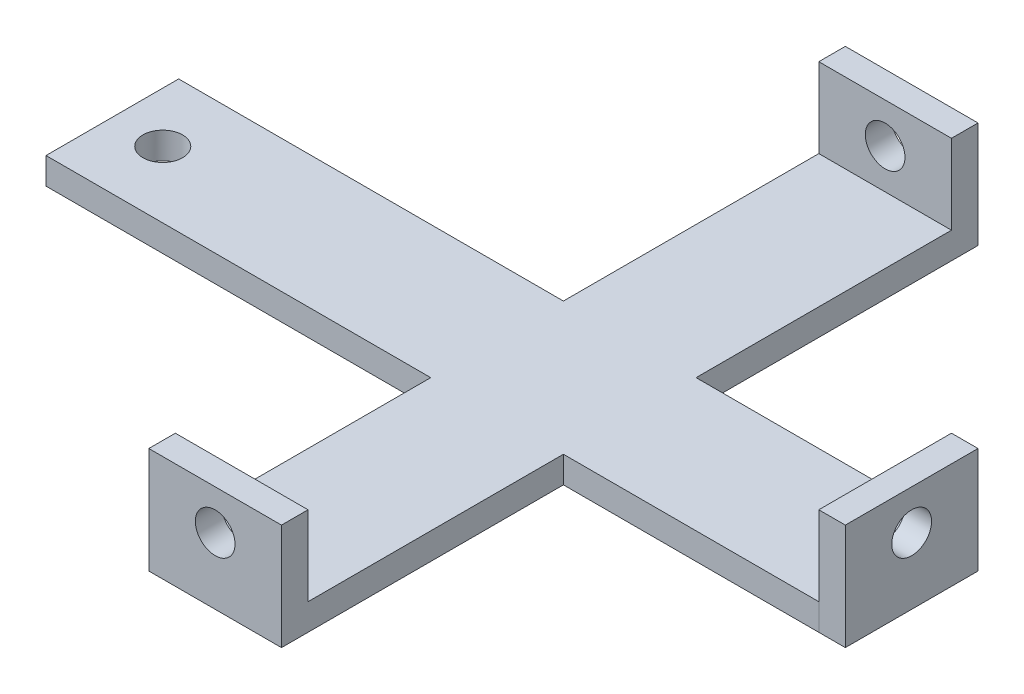
ISO-10303-21;
HEADER;
FILE_DESCRIPTION(('STEP AP214'),'2;1');
FILE_NAME('part.step','',(''),(''),'','','');
FILE_SCHEMA(('AUTOMOTIVE_DESIGN { 1 0 10303 214 1 1 1 1 }'));
ENDSEC;
DATA;
#1=APPLICATION_CONTEXT('core data for automotive mechanical design processes');
#2=APPLICATION_PROTOCOL_DEFINITION('international standard','automotive_design',2000,#1);
#3=PRODUCT_CONTEXT('',#1,'mechanical');
#4=PRODUCT('Part','Part','',(#3));
#5=PRODUCT_RELATED_PRODUCT_CATEGORY('part','',(#4));
#6=PRODUCT_DEFINITION_FORMATION('','',#4);
#7=PRODUCT_DEFINITION_CONTEXT('part definition',#1,'design');
#8=PRODUCT_DEFINITION('design','',#6,#7);
#9=PRODUCT_DEFINITION_SHAPE('','',#8);
#10=(LENGTH_UNIT() NAMED_UNIT(*) SI_UNIT(.MILLI.,.METRE.));
#11=(NAMED_UNIT(*) PLANE_ANGLE_UNIT() SI_UNIT($,.RADIAN.));
#12=(NAMED_UNIT(*) SI_UNIT($,.STERADIAN.) SOLID_ANGLE_UNIT());
#13=UNCERTAINTY_MEASURE_WITH_UNIT(LENGTH_MEASURE(1.E-05),#10,'distance_accuracy_value','');
#14=(GEOMETRIC_REPRESENTATION_CONTEXT(3) GLOBAL_UNCERTAINTY_ASSIGNED_CONTEXT((#13)) GLOBAL_UNIT_ASSIGNED_CONTEXT((#10,
#11,#12)) REPRESENTATION_CONTEXT('',''));
#15=CARTESIAN_POINT('',(0.,0.,0.));
#16=DIRECTION('',(0.,0.,1.));
#17=DIRECTION('',(1.,0.,0.));
#18=AXIS2_PLACEMENT_3D('',#15,#16,#17);
#19=CARTESIAN_POINT('',(39.6875,5.588,-23.1775));
#20=DIRECTION('',(0.,0.,1.));
#21=DIRECTION('',(1.,0.,0.));
#22=AXIS2_PLACEMENT_3D('',#19,#20,#21);
#23=PLANE('',#22);
#24=DIRECTION('',(0.,1.,0.));
#25=VECTOR('',#24,1.);
#26=CARTESIAN_POINT('',(37.1475,5.588,-23.1775));
#27=LINE('',#26,#25);
#28=CARTESIAN_POINT('',(37.1475,5.588,-23.1775));
#29=VERTEX_POINT('',#28);
#30=CARTESIAN_POINT('',(37.1475,15.748,-23.1775));
#31=VERTEX_POINT('',#30);
#32=EDGE_CURVE('E109',#29,#31,#27,.T.);
#33=ORIENTED_EDGE('',*,*,#32,.F.);
#34=DIRECTION('',(-1.,0.,0.));
#35=VECTOR('',#34,1.);
#36=CARTESIAN_POINT('',(39.6875,5.588,-23.1775));
#37=LINE('',#36,#35);
#38=CARTESIAN_POINT('',(39.6875,5.588,-23.1775));
#39=VERTEX_POINT('',#38);
#40=EDGE_CURVE('E12',#39,#29,#37,.T.);
#41=ORIENTED_EDGE('',*,*,#40,.F.);
#42=DIRECTION('',(0.,1.,0.));
#43=VECTOR('',#42,1.);
#44=CARTESIAN_POINT('',(39.6875,5.588,-23.1775));
#45=LINE('',#44,#43);
#46=CARTESIAN_POINT('',(39.6875,15.748,-23.1775));
#47=VERTEX_POINT('',#46);
#48=EDGE_CURVE('E103',#39,#47,#45,.T.);
#49=ORIENTED_EDGE('',*,*,#48,.T.);
#50=DIRECTION('',(-1.,0.,0.));
#51=VECTOR('',#50,1.);
#52=CARTESIAN_POINT('',(39.6875,15.748,-23.1775));
#53=LINE('',#52,#51);
#54=EDGE_CURVE('E46',#47,#31,#53,.T.);
#55=ORIENTED_EDGE('',*,*,#54,.T.);
#56=EDGE_LOOP('',(#33,#41,#49,#55));
#57=FACE_BOUND('',#56,.T.);
#58=ADVANCED_FACE('F43',(#57),#23,.T.);
#59=CARTESIAN_POINT('',(39.6875,5.588,-23.1775));
#60=DIRECTION('',(0.,1.,0.));
#61=DIRECTION('',(0.,0.,1.));
#62=AXIS2_PLACEMENT_3D('',#59,#60,#61);
#63=PLANE('',#62);
#64=DIRECTION('',(0.,0.,-1.));
#65=VECTOR('',#64,1.);
#66=CARTESIAN_POINT('',(37.1475,5.588,-23.1775));
#67=LINE('',#66,#65);
#68=CARTESIAN_POINT('',(37.1475,5.588,-35.8775));
#69=VERTEX_POINT('',#68);
#70=EDGE_CURVE('E76',#29,#69,#67,.T.);
#71=ORIENTED_EDGE('',*,*,#70,.T.);
#72=DIRECTION('',(-1.,0.,0.));
#73=VECTOR('',#72,1.);
#74=CARTESIAN_POINT('',(39.6875,5.588,-35.8775));
#75=LINE('',#74,#73);
#76=CARTESIAN_POINT('',(39.6875,5.588,-35.8775));
#77=VERTEX_POINT('',#76);
#78=EDGE_CURVE('E52',#77,#69,#75,.T.);
#79=ORIENTED_EDGE('',*,*,#78,.F.);
#80=DIRECTION('',(0.,0.,-1.));
#81=VECTOR('',#80,1.);
#82=CARTESIAN_POINT('',(39.6875,5.588,-23.1775));
#83=LINE('',#82,#81);
#84=EDGE_CURVE('E93',#39,#77,#83,.T.);
#85=ORIENTED_EDGE('',*,*,#84,.F.);
#86=ORIENTED_EDGE('',*,*,#40,.T.);
#87=EDGE_LOOP('',(#71,#79,#85,#86));
#88=FACE_BOUND('',#87,.T.);
#89=ADVANCED_FACE('F120',(#88),#63,.F.);
#90=CARTESIAN_POINT('',(39.6875,5.588,-35.8775));
#91=DIRECTION('',(0.,0.,1.));
#92=DIRECTION('',(1.,0.,0.));
#93=AXIS2_PLACEMENT_3D('',#90,#91,#92);
#94=PLANE('',#93);
#95=DIRECTION('',(0.,1.,0.));
#96=VECTOR('',#95,1.);
#97=CARTESIAN_POINT('',(37.1475,5.588,-35.8775));
#98=LINE('',#97,#96);
#99=CARTESIAN_POINT('',(37.1475,15.748,-35.8775));
#100=VERTEX_POINT('',#99);
#101=EDGE_CURVE('E100',#69,#100,#98,.T.);
#102=ORIENTED_EDGE('',*,*,#101,.T.);
#103=DIRECTION('',(-1.,0.,0.));
#104=VECTOR('',#103,1.);
#105=CARTESIAN_POINT('',(39.6875,15.748,-35.8775));
#106=LINE('',#105,#104);
#107=CARTESIAN_POINT('',(39.6875,15.748,-35.8775));
#108=VERTEX_POINT('',#107);
#109=EDGE_CURVE('E97',#108,#100,#106,.T.);
#110=ORIENTED_EDGE('',*,*,#109,.F.);
#111=DIRECTION('',(0.,1.,0.));
#112=VECTOR('',#111,1.);
#113=CARTESIAN_POINT('',(39.6875,5.588,-35.8775));
#114=LINE('',#113,#112);
#115=EDGE_CURVE('E88',#77,#108,#114,.T.);
#116=ORIENTED_EDGE('',*,*,#115,.F.);
#117=ORIENTED_EDGE('',*,*,#78,.T.);
#118=EDGE_LOOP('',(#102,#110,#116,#117));
#119=FACE_BOUND('',#118,.T.);
#120=ADVANCED_FACE('F98',(#119),#94,.F.);
#121=CARTESIAN_POINT('',(39.6875,15.748,-23.1775));
#122=DIRECTION('',(0.,1.,0.));
#123=DIRECTION('',(0.,0.,1.));
#124=AXIS2_PLACEMENT_3D('',#121,#122,#123);
#125=PLANE('',#124);
#126=DIRECTION('',(0.,0.,-1.));
#127=VECTOR('',#126,1.);
#128=CARTESIAN_POINT('',(37.1475,15.748,-23.1775));
#129=LINE('',#128,#127);
#130=EDGE_CURVE('E112',#31,#100,#129,.T.);
#131=ORIENTED_EDGE('',*,*,#130,.F.);
#132=ORIENTED_EDGE('',*,*,#54,.F.);
#133=DIRECTION('',(0.,0.,-1.));
#134=VECTOR('',#133,1.);
#135=CARTESIAN_POINT('',(39.6875,15.748,-23.1775));
#136=LINE('',#135,#134);
#137=EDGE_CURVE('E92',#47,#108,#136,.T.);
#138=ORIENTED_EDGE('',*,*,#137,.T.);
#139=ORIENTED_EDGE('',*,*,#109,.T.);
#140=EDGE_LOOP('',(#131,#132,#138,#139));
#141=FACE_BOUND('',#140,.T.);
#142=ADVANCED_FACE('F102',(#141),#125,.T.);
#143=CARTESIAN_POINT('',(39.6875,0.,0.));
#144=DIRECTION('',(-1.,0.,0.));
#145=DIRECTION('',(0.,0.,1.));
#146=AXIS2_PLACEMENT_3D('',#143,#144,#145);
#147=PLANE('',#146);
#148=CARTESIAN_POINT('',(39.6875,11.938,-29.5275));
#149=DIRECTION('',(1.,0.,0.));
#150=DIRECTION('',(0.,0.,-1.));
#151=AXIS2_PLACEMENT_3D('',#148,#149,#150);
#152=CIRCLE('',#151,1.905);
#153=CARTESIAN_POINT('',(39.6875,11.938,-31.4325));
#154=VERTEX_POINT('',#153);
#155=EDGE_CURVE('E151',#154,#154,#152,.T.);
#156=ORIENTED_EDGE('',*,*,#155,.F.);
#157=EDGE_LOOP('',(#156));
#158=FACE_BOUND('',#157,.T.);
#159=ORIENTED_EDGE('',*,*,#48,.F.);
#160=ORIENTED_EDGE('',*,*,#84,.T.);
#161=ORIENTED_EDGE('',*,*,#115,.T.);
#162=ORIENTED_EDGE('',*,*,#137,.F.);
#163=EDGE_LOOP('',(#159,#160,#161,#162));
#164=FACE_BOUND('',#163,.T.);
#165=ADVANCED_FACE('F91',(#158,#164),#147,.F.);
#166=CARTESIAN_POINT('',(37.1475,0.,0.));
#167=DIRECTION('',(-1.,0.,0.));
#168=DIRECTION('',(0.,0.,1.));
#169=AXIS2_PLACEMENT_3D('',#166,#167,#168);
#170=PLANE('',#169);
#171=CARTESIAN_POINT('',(37.1475,11.938,-29.5275));
#172=DIRECTION('',(1.,0.,0.));
#173=DIRECTION('',(0.,0.,-1.));
#174=AXIS2_PLACEMENT_3D('',#171,#172,#173);
#175=CIRCLE('',#174,1.905);
#176=CARTESIAN_POINT('',(37.1475,11.938,-31.4325));
#177=VERTEX_POINT('',#176);
#178=EDGE_CURVE('E113',#177,#177,#175,.T.);
#179=ORIENTED_EDGE('',*,*,#178,.T.);
#180=EDGE_LOOP('',(#179));
#181=FACE_BOUND('',#180,.T.);
#182=ORIENTED_EDGE('',*,*,#32,.T.);
#183=ORIENTED_EDGE('',*,*,#130,.T.);
#184=ORIENTED_EDGE('',*,*,#101,.F.);
#185=ORIENTED_EDGE('',*,*,#70,.F.);
#186=EDGE_LOOP('',(#182,#183,#184,#185));
#187=FACE_BOUND('',#186,.T.);
#188=ADVANCED_FACE('F118',(#181,#187),#170,.T.);
#189=CARTESIAN_POINT('',(37.1475,11.938,-29.5275));
#190=DIRECTION('',(1.,0.,0.));
#191=DIRECTION('',(0.,0.,-1.));
#192=AXIS2_PLACEMENT_3D('',#189,#190,#191);
#193=CYLINDRICAL_SURFACE('',#192,1.905);
#194=ORIENTED_EDGE('',*,*,#178,.F.);
#195=EDGE_LOOP('',(#194));
#196=FACE_BOUND('',#195,.T.);
#197=ORIENTED_EDGE('',*,*,#155,.T.);
#198=EDGE_LOOP('',(#197));
#199=FACE_BOUND('',#198,.T.);
#200=ADVANCED_FACE('F139',(#196,#199),#193,.F.);
#201=CLOSED_SHELL('',(#58,#89,#120,#142,#165,#188,#200));
#202=MANIFOLD_SOLID_BREP('B2',#201);
#203=CARTESIAN_POINT('',(0.,0.,0.));
#204=DIRECTION('',(-1.,0.,0.));
#205=DIRECTION('',(0.,0.,1.));
#206=AXIS2_PLACEMENT_3D('',#203,#204,#205);
#207=PLANE('',#206);
#208=DIRECTION('',(0.,-1.,0.));
#209=VECTOR('',#208,1.);
#210=CARTESIAN_POINT('',(0.,8.128,-35.8775));
#211=LINE('',#210,#209);
#212=CARTESIAN_POINT('',(0.,8.128,-35.8775));
#213=VERTEX_POINT('',#212);
#214=CARTESIAN_POINT('',(0.,5.588,-35.8775));
#215=VERTEX_POINT('',#214);
#216=EDGE_CURVE('E324',#213,#215,#211,.T.);
#217=ORIENTED_EDGE('',*,*,#216,.F.);
#218=DIRECTION('',(0.,0.,1.));
#219=VECTOR('',#218,1.);
#220=CARTESIAN_POINT('',(0.,8.128,1.27));
#221=LINE('',#220,#219);
#222=CARTESIAN_POINT('',(0.,8.128,-60.325));
#223=VERTEX_POINT('',#222);
#224=EDGE_CURVE('E377',#223,#213,#221,.T.);
#225=ORIENTED_EDGE('',*,*,#224,.F.);
#226=DIRECTION('',(0.,-1.,0.));
#227=VECTOR('',#226,1.);
#228=CARTESIAN_POINT('',(0.,8.128,-60.325));
#229=LINE('',#228,#227);
#230=CARTESIAN_POINT('',(0.,15.748,-60.325));
#231=VERTEX_POINT('',#230);
#232=EDGE_CURVE('E387',#231,#223,#229,.T.);
#233=ORIENTED_EDGE('',*,*,#232,.F.);
#234=DIRECTION('',(0.,0.,-1.));
#235=VECTOR('',#234,1.);
#236=CARTESIAN_POINT('',(0.,15.748,-60.325));
#237=LINE('',#236,#235);
#238=CARTESIAN_POINT('',(0.,15.748,-62.865));
#239=VERTEX_POINT('',#238);
#240=EDGE_CURVE('E525',#231,#239,#237,.T.);
#241=ORIENTED_EDGE('',*,*,#240,.T.);
#242=DIRECTION('',(0.,1.,0.));
#243=VECTOR('',#242,1.);
#244=CARTESIAN_POINT('',(0.,8.128,-62.865));
#245=LINE('',#244,#243);
#246=CARTESIAN_POINT('',(0.,5.588,-62.865));
#247=VERTEX_POINT('',#246);
#248=EDGE_CURVE('E520',#239,#247,#245,.F.);
#249=ORIENTED_EDGE('',*,*,#248,.T.);
#250=DIRECTION('',(0.,0.,-1.));
#251=VECTOR('',#250,1.);
#252=CARTESIAN_POINT('',(0.,5.588,1.27));
#253=LINE('',#252,#251);
#254=EDGE_CURVE('E213',#247,#215,#253,.F.);
#255=ORIENTED_EDGE('',*,*,#254,.T.);
#256=EDGE_LOOP('',(#217,#225,#233,#241,#249,#255));
#257=FACE_BOUND('',#256,.T.);
#258=ADVANCED_FACE('F188',(#257),#207,.T.);
#259=CARTESIAN_POINT('',(12.7,0.,0.));
#260=DIRECTION('',(-1.,0.,0.));
#261=DIRECTION('',(0.,0.,1.));
#262=AXIS2_PLACEMENT_3D('',#259,#260,#261);
#263=PLANE('',#262);
#264=DIRECTION('',(0.,-1.,0.));
#265=VECTOR('',#264,1.);
#266=CARTESIAN_POINT('',(12.7,8.128,-23.1775));
#267=LINE('',#266,#265);
#268=CARTESIAN_POINT('',(12.7,8.128,-23.1775));
#269=VERTEX_POINT('',#268);
#270=CARTESIAN_POINT('',(12.7,5.588,-23.1775));
#271=VERTEX_POINT('',#270);
#272=EDGE_CURVE('E325',#269,#271,#267,.T.);
#273=ORIENTED_EDGE('',*,*,#272,.F.);
#274=DIRECTION('',(0.,0.,1.));
#275=VECTOR('',#274,1.);
#276=CARTESIAN_POINT('',(12.7,8.128,1.27));
#277=LINE('',#276,#275);
#278=CARTESIAN_POINT('',(12.7,8.128,1.27));
#279=VERTEX_POINT('',#278);
#280=EDGE_CURVE('E433',#269,#279,#277,.T.);
#281=ORIENTED_EDGE('',*,*,#280,.T.);
#282=DIRECTION('',(0.,1.,0.));
#283=VECTOR('',#282,1.);
#284=CARTESIAN_POINT('',(12.7,8.128,1.27));
#285=LINE('',#284,#283);
#286=CARTESIAN_POINT('',(12.7,15.748,1.27));
#287=VERTEX_POINT('',#286);
#288=EDGE_CURVE('E382',#279,#287,#285,.T.);
#289=ORIENTED_EDGE('',*,*,#288,.T.);
#290=DIRECTION('',(0.,0.,-1.));
#291=VECTOR('',#290,1.);
#292=CARTESIAN_POINT('',(12.7,15.748,3.81));
#293=LINE('',#292,#291);
#294=CARTESIAN_POINT('',(12.7,15.748,3.81));
#295=VERTEX_POINT('',#294);
#296=EDGE_CURVE('E385',#295,#287,#293,.T.);
#297=ORIENTED_EDGE('',*,*,#296,.F.);
#298=DIRECTION('',(0.,1.,0.));
#299=VECTOR('',#298,1.);
#300=CARTESIAN_POINT('',(12.7,8.128,3.81));
#301=LINE('',#300,#299);
#302=CARTESIAN_POINT('',(12.7,5.588,3.81));
#303=VERTEX_POINT('',#302);
#304=EDGE_CURVE('E423',#303,#295,#301,.T.);
#305=ORIENTED_EDGE('',*,*,#304,.F.);
#306=DIRECTION('',(0.,0.,-1.));
#307=VECTOR('',#306,1.);
#308=CARTESIAN_POINT('',(12.7,5.588,1.27));
#309=LINE('',#308,#307);
#310=EDGE_CURVE('E418',#271,#303,#309,.F.);
#311=ORIENTED_EDGE('',*,*,#310,.F.);
#312=EDGE_LOOP('',(#273,#281,#289,#297,#305,#311));
#313=FACE_BOUND('',#312,.T.);
#314=ADVANCED_FACE('F446',(#313),#263,.F.);
#315=DIRECTION('',(0.,1.,0.));
#316=VECTOR('',#315,1.);
#317=CARTESIAN_POINT('',(12.7,8.128,-35.8775));
#318=LINE('',#317,#316);
#319=CARTESIAN_POINT('',(12.7,5.588,-35.8775));
#320=VERTEX_POINT('',#319);
#321=CARTESIAN_POINT('',(12.7,8.128,-35.8775));
#322=VERTEX_POINT('',#321);
#323=EDGE_CURVE('E328',#320,#322,#318,.T.);
#324=ORIENTED_EDGE('',*,*,#323,.F.);
#325=CARTESIAN_POINT('',(12.7,5.588,-62.865));
#326=VERTEX_POINT('',#325);
#327=EDGE_CURVE('E413',#326,#320,#309,.F.);
#328=ORIENTED_EDGE('',*,*,#327,.F.);
#329=DIRECTION('',(0.,1.,0.));
#330=VECTOR('',#329,1.);
#331=CARTESIAN_POINT('',(12.7,8.128,-62.865));
#332=LINE('',#331,#330);
#333=CARTESIAN_POINT('',(12.7,15.748,-62.865));
#334=VERTEX_POINT('',#333);
#335=EDGE_CURVE('E417',#334,#326,#332,.F.);
#336=ORIENTED_EDGE('',*,*,#335,.F.);
#337=DIRECTION('',(0.,0.,-1.));
#338=VECTOR('',#337,1.);
#339=CARTESIAN_POINT('',(12.7,15.748,-60.325));
#340=LINE('',#339,#338);
#341=CARTESIAN_POINT('',(12.7,15.748,-60.325));
#342=VERTEX_POINT('',#341);
#343=EDGE_CURVE('E428',#342,#334,#340,.T.);
#344=ORIENTED_EDGE('',*,*,#343,.F.);
#345=DIRECTION('',(0.,-1.,0.));
#346=VECTOR('',#345,1.);
#347=CARTESIAN_POINT('',(12.7,8.128,-60.325));
#348=LINE('',#347,#346);
#349=CARTESIAN_POINT('',(12.7,8.128,-60.325));
#350=VERTEX_POINT('',#349);
#351=EDGE_CURVE('E431',#342,#350,#348,.T.);
#352=ORIENTED_EDGE('',*,*,#351,.T.);
#353=EDGE_CURVE('E401',#350,#322,#277,.T.);
#354=ORIENTED_EDGE('',*,*,#353,.T.);
#355=EDGE_LOOP('',(#324,#328,#336,#344,#352,#354));
#356=FACE_BOUND('',#355,.T.);
#357=ADVANCED_FACE('F514',(#356),#263,.F.);
#358=CARTESIAN_POINT('',(12.7,8.128,1.27));
#359=DIRECTION('',(0.,0.,1.));
#360=DIRECTION('',(1.,0.,0.));
#361=AXIS2_PLACEMENT_3D('',#358,#359,#360);
#362=PLANE('',#361);
#363=CARTESIAN_POINT('',(6.35,11.938,1.27));
#364=DIRECTION('',(0.,0.,-1.));
#365=DIRECTION('',(-1.,0.,0.));
#366=AXIS2_PLACEMENT_3D('',#363,#364,#365);
#367=CIRCLE('',#366,1.89864999999999);
#368=CARTESIAN_POINT('',(4.45135000000001,11.938,1.27));
#369=VERTEX_POINT('',#368);
#370=EDGE_CURVE('E466',#369,#369,#367,.T.);
#371=ORIENTED_EDGE('',*,*,#370,.F.);
#372=EDGE_LOOP('',(#371));
#373=FACE_BOUND('',#372,.T.);
#374=DIRECTION('',(0.,1.,0.));
#375=VECTOR('',#374,1.);
#376=CARTESIAN_POINT('',(0.,8.128,1.27));
#377=LINE('',#376,#375);
#378=CARTESIAN_POINT('',(0.,8.128,1.27));
#379=VERTEX_POINT('',#378);
#380=CARTESIAN_POINT('',(0.,15.748,1.27));
#381=VERTEX_POINT('',#380);
#382=EDGE_CURVE('E436',#379,#381,#377,.T.);
#383=ORIENTED_EDGE('',*,*,#382,.T.);
#384=DIRECTION('',(-1.,0.,0.));
#385=VECTOR('',#384,1.);
#386=CARTESIAN_POINT('',(12.7,15.748,1.27));
#387=LINE('',#386,#385);
#388=EDGE_CURVE('E41',#287,#381,#387,.T.);
#389=ORIENTED_EDGE('',*,*,#388,.F.);
#390=ORIENTED_EDGE('',*,*,#288,.F.);
#391=DIRECTION('',(-1.,0.,0.));
#392=VECTOR('',#391,1.);
#393=CARTESIAN_POINT('',(12.7,8.128,1.27));
#394=LINE('',#393,#392);
#395=EDGE_CURVE('E397',#279,#379,#394,.T.);
#396=ORIENTED_EDGE('',*,*,#395,.T.);
#397=EDGE_LOOP('',(#383,#389,#390,#396));
#398=FACE_BOUND('',#397,.T.);
#399=ADVANCED_FACE('F190',(#373,#398),#362,.F.);
#400=CARTESIAN_POINT('',(12.7,15.748,3.81));
#401=DIRECTION('',(0.,1.,0.));
#402=DIRECTION('',(0.,0.,1.));
#403=AXIS2_PLACEMENT_3D('',#400,#401,#402);
#404=PLANE('',#403);
#405=DIRECTION('',(0.,0.,-1.));
#406=VECTOR('',#405,1.);
#407=CARTESIAN_POINT('',(0.,15.748,3.81));
#408=LINE('',#407,#406);
#409=CARTESIAN_POINT('',(0.,15.748,3.81));
#410=VERTEX_POINT('',#409);
#411=EDGE_CURVE('E534',#410,#381,#408,.T.);
#412=ORIENTED_EDGE('',*,*,#411,.F.);
#413=DIRECTION('',(-1.,0.,0.));
#414=VECTOR('',#413,1.);
#415=CARTESIAN_POINT('',(12.7,15.748,3.81));
#416=LINE('',#415,#414);
#417=EDGE_CURVE('E197',#295,#410,#416,.T.);
#418=ORIENTED_EDGE('',*,*,#417,.F.);
#419=ORIENTED_EDGE('',*,*,#296,.T.);
#420=ORIENTED_EDGE('',*,*,#388,.T.);
#421=EDGE_LOOP('',(#412,#418,#419,#420));
#422=FACE_BOUND('',#421,.T.);
#423=ADVANCED_FACE('F459',(#422),#404,.T.);
#424=CARTESIAN_POINT('',(12.7,8.128,3.81));
#425=DIRECTION('',(0.,0.,1.));
#426=DIRECTION('',(1.,0.,0.));
#427=AXIS2_PLACEMENT_3D('',#424,#425,#426);
#428=PLANE('',#427);
#429=CARTESIAN_POINT('',(6.35,11.938,3.81));
#430=DIRECTION('',(0.,0.,1.));
#431=DIRECTION('',(1.,0.,0.));
#432=AXIS2_PLACEMENT_3D('',#429,#430,#431);
#433=CIRCLE('',#432,1.89864999999999);
#434=CARTESIAN_POINT('',(8.24864999999999,11.938,3.81));
#435=VERTEX_POINT('',#434);
#436=EDGE_CURVE('E463',#435,#435,#433,.T.);
#437=ORIENTED_EDGE('',*,*,#436,.F.);
#438=EDGE_LOOP('',(#437));
#439=FACE_BOUND('',#438,.T.);
#440=DIRECTION('',(0.,1.,0.));
#441=VECTOR('',#440,1.);
#442=CARTESIAN_POINT('',(0.,8.128,3.81));
#443=LINE('',#442,#441);
#444=CARTESIAN_POINT('',(0.,5.588,3.81));
#445=VERTEX_POINT('',#444);
#446=EDGE_CURVE('E531',#445,#410,#443,.T.);
#447=ORIENTED_EDGE('',*,*,#446,.F.);
#448=DIRECTION('',(-1.,0.,0.));
#449=VECTOR('',#448,1.);
#450=CARTESIAN_POINT('',(12.7,5.588,3.81));
#451=LINE('',#450,#449);
#452=EDGE_CURVE('E409',#303,#445,#451,.T.);
#453=ORIENTED_EDGE('',*,*,#452,.F.);
#454=ORIENTED_EDGE('',*,*,#304,.T.);
#455=ORIENTED_EDGE('',*,*,#417,.T.);
#456=EDGE_LOOP('',(#447,#453,#454,#455));
#457=FACE_BOUND('',#456,.T.);
#458=ADVANCED_FACE('F604',(#439,#457),#428,.T.);
#459=CARTESIAN_POINT('',(12.7,5.588,1.27));
#460=DIRECTION('',(0.,-1.,0.));
#461=DIRECTION('',(0.,0.,-1.));
#462=AXIS2_PLACEMENT_3D('',#459,#460,#461);
#463=PLANE('',#462);
#464=CARTESIAN_POINT('',(-32.004,5.588,-29.5275));
#465=DIRECTION('',(0.,-1.,0.));
#466=DIRECTION('',(0.,0.,-1.));
#467=AXIS2_PLACEMENT_3D('',#464,#465,#466);
#468=CIRCLE('',#467,1.89864999999999);
#469=CARTESIAN_POINT('',(-32.004,5.588,-31.42615));
#470=VERTEX_POINT('',#469);
#471=EDGE_CURVE('E338',#470,#470,#468,.T.);
#472=ORIENTED_EDGE('',*,*,#471,.F.);
#473=EDGE_LOOP('',(#472));
#474=FACE_BOUND('',#473,.T.);
#475=ORIENTED_EDGE('',*,*,#254,.F.);
#476=DIRECTION('',(-1.,0.,0.));
#477=VECTOR('',#476,1.);
#478=CARTESIAN_POINT('',(12.7,5.588,-62.865));
#479=LINE('',#478,#477);
#480=EDGE_CURVE('E407',#326,#247,#479,.T.);
#481=ORIENTED_EDGE('',*,*,#480,.F.);
#482=ORIENTED_EDGE('',*,*,#327,.T.);
#483=DIRECTION('',(-1.,0.,0.));
#484=VECTOR('',#483,1.);
#485=CARTESIAN_POINT('',(37.1475,5.588,-35.8775));
#486=LINE('',#485,#484);
#487=CARTESIAN_POINT('',(37.1475,5.588,-35.8775));
#488=VERTEX_POINT('',#487);
#489=EDGE_CURVE('E484',#488,#320,#486,.T.);
#490=ORIENTED_EDGE('',*,*,#489,.F.);
#491=DIRECTION('',(0.,0.,-1.));
#492=VECTOR('',#491,1.);
#493=CARTESIAN_POINT('',(37.1475,5.588,-23.1775));
#494=LINE('',#493,#492);
#495=CARTESIAN_POINT('',(37.1475,5.588,-23.1775));
#496=VERTEX_POINT('',#495);
#497=EDGE_CURVE('E502',#496,#488,#494,.T.);
#498=ORIENTED_EDGE('',*,*,#497,.F.);
#499=DIRECTION('',(-1.,0.,0.));
#500=VECTOR('',#499,1.);
#501=CARTESIAN_POINT('',(37.1475,5.588,-23.1775));
#502=LINE('',#501,#500);
#503=EDGE_CURVE('E475',#496,#271,#502,.T.);
#504=ORIENTED_EDGE('',*,*,#503,.T.);
#505=ORIENTED_EDGE('',*,*,#310,.T.);
#506=ORIENTED_EDGE('',*,*,#452,.T.);
#507=CARTESIAN_POINT('',(0.,5.588,-23.1775));
#508=VERTEX_POINT('',#507);
#509=EDGE_CURVE('E351',#508,#445,#253,.F.);
#510=ORIENTED_EDGE('',*,*,#509,.F.);
#511=DIRECTION('',(1.,0.,0.));
#512=VECTOR('',#511,1.);
#513=CARTESIAN_POINT('',(-36.83,5.588,-23.1775));
#514=LINE('',#513,#512);
#515=CARTESIAN_POINT('',(-36.83,5.588,-23.1775));
#516=VERTEX_POINT('',#515);
#517=EDGE_CURVE('E309',#516,#508,#514,.T.);
#518=ORIENTED_EDGE('',*,*,#517,.F.);
#519=DIRECTION('',(0.,0.,1.));
#520=VECTOR('',#519,1.);
#521=CARTESIAN_POINT('',(-36.83,5.588,-35.8775));
#522=LINE('',#521,#520);
#523=CARTESIAN_POINT('',(-36.83,5.588,-35.8775));
#524=VERTEX_POINT('',#523);
#525=EDGE_CURVE('E302',#524,#516,#522,.T.);
#526=ORIENTED_EDGE('',*,*,#525,.F.);
#527=DIRECTION('',(1.,0.,0.));
#528=VECTOR('',#527,1.);
#529=CARTESIAN_POINT('',(-36.83,5.588,-35.8775));
#530=LINE('',#529,#528);
#531=EDGE_CURVE('E306',#524,#215,#530,.T.);
#532=ORIENTED_EDGE('',*,*,#531,.T.);
#533=EDGE_LOOP('',(#475,#481,#482,#490,#498,#504,#505,#506,#510,#518,#526,#532));
#534=FACE_BOUND('',#533,.T.);
#535=ADVANCED_FACE('F304',(#474,#534),#463,.T.);
#536=CARTESIAN_POINT('',(12.7,8.128,-62.865));
#537=DIRECTION('',(0.,0.,-1.));
#538=DIRECTION('',(-1.,0.,0.));
#539=AXIS2_PLACEMENT_3D('',#536,#537,#538);
#540=PLANE('',#539);
#541=CARTESIAN_POINT('',(6.35,11.938,-62.865));
#542=DIRECTION('',(0.,0.,-1.));
#543=DIRECTION('',(-1.,0.,0.));
#544=AXIS2_PLACEMENT_3D('',#541,#542,#543);
#545=CIRCLE('',#544,1.89864999999999);
#546=CARTESIAN_POINT('',(4.45135000000001,11.938,-62.865));
#547=VERTEX_POINT('',#546);
#548=EDGE_CURVE('E469',#547,#547,#545,.T.);
#549=ORIENTED_EDGE('',*,*,#548,.F.);
#550=EDGE_LOOP('',(#549));
#551=FACE_BOUND('',#550,.T.);
#552=ORIENTED_EDGE('',*,*,#248,.F.);
#553=DIRECTION('',(-1.,0.,0.));
#554=VECTOR('',#553,1.);
#555=CARTESIAN_POINT('',(12.7,15.748,-62.865));
#556=LINE('',#555,#554);
#557=EDGE_CURVE('E405',#334,#239,#556,.T.);
#558=ORIENTED_EDGE('',*,*,#557,.F.);
#559=ORIENTED_EDGE('',*,*,#335,.T.);
#560=ORIENTED_EDGE('',*,*,#480,.T.);
#561=EDGE_LOOP('',(#552,#558,#559,#560));
#562=FACE_BOUND('',#561,.T.);
#563=ADVANCED_FACE('F519',(#551,#562),#540,.T.);
#564=CARTESIAN_POINT('',(12.7,15.748,-60.325));
#565=DIRECTION('',(0.,1.,0.));
#566=DIRECTION('',(0.,0.,1.));
#567=AXIS2_PLACEMENT_3D('',#564,#565,#566);
#568=PLANE('',#567);
#569=ORIENTED_EDGE('',*,*,#240,.F.);
#570=DIRECTION('',(-1.,0.,0.));
#571=VECTOR('',#570,1.);
#572=CARTESIAN_POINT('',(12.7,15.748,-60.325));
#573=LINE('',#572,#571);
#574=EDGE_CURVE('E403',#342,#231,#573,.T.);
#575=ORIENTED_EDGE('',*,*,#574,.F.);
#576=ORIENTED_EDGE('',*,*,#343,.T.);
#577=ORIENTED_EDGE('',*,*,#557,.T.);
#578=EDGE_LOOP('',(#569,#575,#576,#577));
#579=FACE_BOUND('',#578,.T.);
#580=ADVANCED_FACE('F524',(#579),#568,.T.);
#581=CARTESIAN_POINT('',(12.7,8.128,-60.325));
#582=DIRECTION('',(0.,0.,-1.));
#583=DIRECTION('',(-1.,0.,0.));
#584=AXIS2_PLACEMENT_3D('',#581,#582,#583);
#585=PLANE('',#584);
#586=CARTESIAN_POINT('',(6.35,11.938,-60.325));
#587=DIRECTION('',(0.,0.,1.));
#588=DIRECTION('',(1.,0.,0.));
#589=AXIS2_PLACEMENT_3D('',#586,#587,#588);
#590=CIRCLE('',#589,1.89864999999999);
#591=CARTESIAN_POINT('',(8.24864999999999,11.938,-60.325));
#592=VERTEX_POINT('',#591);
#593=EDGE_CURVE('E472',#592,#592,#590,.T.);
#594=ORIENTED_EDGE('',*,*,#593,.F.);
#595=EDGE_LOOP('',(#594));
#596=FACE_BOUND('',#595,.T.);
#597=ORIENTED_EDGE('',*,*,#232,.T.);
#598=DIRECTION('',(-1.,0.,0.));
#599=VECTOR('',#598,1.);
#600=CARTESIAN_POINT('',(12.7,8.128,-60.325));
#601=LINE('',#600,#599);
#602=EDGE_CURVE('E380',#350,#223,#601,.T.);
#603=ORIENTED_EDGE('',*,*,#602,.F.);
#604=ORIENTED_EDGE('',*,*,#351,.F.);
#605=ORIENTED_EDGE('',*,*,#574,.T.);
#606=EDGE_LOOP('',(#597,#603,#604,#605));
#607=FACE_BOUND('',#606,.T.);
#608=ADVANCED_FACE('F372',(#596,#607),#585,.F.);
#609=CARTESIAN_POINT('',(12.7,8.128,1.27));
#610=DIRECTION('',(0.,-1.,0.));
#611=DIRECTION('',(0.,0.,-1.));
#612=AXIS2_PLACEMENT_3D('',#609,#610,#611);
#613=PLANE('',#612);
#614=CARTESIAN_POINT('',(-32.004,8.128,-29.5275));
#615=DIRECTION('',(0.,1.,0.));
#616=DIRECTION('',(0.,0.,1.));
#617=AXIS2_PLACEMENT_3D('',#614,#615,#616);
#618=CIRCLE('',#617,1.89864999999999);
#619=CARTESIAN_POINT('',(-32.004,8.128,-27.62885));
#620=VERTEX_POINT('',#619);
#621=EDGE_CURVE('E362',#620,#620,#618,.T.);
#622=ORIENTED_EDGE('',*,*,#621,.F.);
#623=EDGE_LOOP('',(#622));
#624=FACE_BOUND('',#623,.T.);
#625=ORIENTED_EDGE('',*,*,#224,.T.);
#626=DIRECTION('',(1.,0.,0.));
#627=VECTOR('',#626,1.);
#628=CARTESIAN_POINT('',(-36.83,8.128,-35.8775));
#629=LINE('',#628,#627);
#630=CARTESIAN_POINT('',(-36.83,8.128,-35.8775));
#631=VERTEX_POINT('',#630);
#632=EDGE_CURVE('E339',#631,#213,#629,.T.);
#633=ORIENTED_EDGE('',*,*,#632,.F.);
#634=DIRECTION('',(0.,0.,-1.));
#635=VECTOR('',#634,1.);
#636=CARTESIAN_POINT('',(-36.83,8.128,-35.8775));
#637=LINE('',#636,#635);
#638=CARTESIAN_POINT('',(-36.83,8.128,-23.1775));
#639=VERTEX_POINT('',#638);
#640=EDGE_CURVE('E318',#639,#631,#637,.T.);
#641=ORIENTED_EDGE('',*,*,#640,.F.);
#642=DIRECTION('',(1.,0.,0.));
#643=VECTOR('',#642,1.);
#644=CARTESIAN_POINT('',(-36.83,8.128,-23.1775));
#645=LINE('',#644,#643);
#646=CARTESIAN_POINT('',(0.,8.128,-23.1775));
#647=VERTEX_POINT('',#646);
#648=EDGE_CURVE('E330',#639,#647,#645,.T.);
#649=ORIENTED_EDGE('',*,*,#648,.T.);
#650=EDGE_CURVE('E383',#647,#379,#221,.T.);
#651=ORIENTED_EDGE('',*,*,#650,.T.);
#652=ORIENTED_EDGE('',*,*,#395,.F.);
#653=ORIENTED_EDGE('',*,*,#280,.F.);
#654=DIRECTION('',(-1.,0.,0.));
#655=VECTOR('',#654,1.);
#656=CARTESIAN_POINT('',(37.1475,8.128,-23.1775));
#657=LINE('',#656,#655);
#658=CARTESIAN_POINT('',(37.1475,8.128,-23.1775));
#659=VERTEX_POINT('',#658);
#660=EDGE_CURVE('E485',#659,#269,#657,.T.);
#661=ORIENTED_EDGE('',*,*,#660,.F.);
#662=DIRECTION('',(0.,0.,1.));
#663=VECTOR('',#662,1.);
#664=CARTESIAN_POINT('',(37.1475,8.128,-23.1775));
#665=LINE('',#664,#663);
#666=CARTESIAN_POINT('',(37.1475,8.128,-35.8775));
#667=VERTEX_POINT('',#666);
#668=EDGE_CURVE('E495',#667,#659,#665,.T.);
#669=ORIENTED_EDGE('',*,*,#668,.F.);
#670=DIRECTION('',(-1.,0.,0.));
#671=VECTOR('',#670,1.);
#672=CARTESIAN_POINT('',(37.1475,8.128,-35.8775));
#673=LINE('',#672,#671);
#674=EDGE_CURVE('E481',#667,#322,#673,.T.);
#675=ORIENTED_EDGE('',*,*,#674,.T.);
#676=ORIENTED_EDGE('',*,*,#353,.F.);
#677=ORIENTED_EDGE('',*,*,#602,.T.);
#678=EDGE_LOOP('',(#625,#633,#641,#649,#651,#652,#653,#661,#669,#675,#676,#677));
#679=FACE_BOUND('',#678,.T.);
#680=ADVANCED_FACE('F369',(#624,#679),#613,.F.);
#681=DIRECTION('',(0.,1.,0.));
#682=VECTOR('',#681,1.);
#683=CARTESIAN_POINT('',(0.,8.128,-23.1775));
#684=LINE('',#683,#682);
#685=EDGE_CURVE('E205',#508,#647,#684,.T.);
#686=ORIENTED_EDGE('',*,*,#685,.F.);
#687=ORIENTED_EDGE('',*,*,#509,.T.);
#688=ORIENTED_EDGE('',*,*,#446,.T.);
#689=ORIENTED_EDGE('',*,*,#411,.T.);
#690=ORIENTED_EDGE('',*,*,#382,.F.);
#691=ORIENTED_EDGE('',*,*,#650,.F.);
#692=EDGE_LOOP('',(#686,#687,#688,#689,#690,#691));
#693=FACE_BOUND('',#692,.T.);
#694=ADVANCED_FACE('F371',(#693),#207,.T.);
#695=CARTESIAN_POINT('',(6.35,11.938,1.27));
#696=DIRECTION('',(0.,0.,-1.));
#697=DIRECTION('',(-1.,0.,0.));
#698=AXIS2_PLACEMENT_3D('',#695,#696,#697);
#699=CYLINDRICAL_SURFACE('',#698,1.89864999999999);
#700=ORIENTED_EDGE('',*,*,#436,.T.);
#701=EDGE_LOOP('',(#700));
#702=FACE_BOUND('',#701,.T.);
#703=ORIENTED_EDGE('',*,*,#370,.T.);
#704=EDGE_LOOP('',(#703));
#705=FACE_BOUND('',#704,.T.);
#706=ADVANCED_FACE('F553',(#702,#705),#699,.F.);
#707=CARTESIAN_POINT('',(6.35,11.938,-60.325));
#708=DIRECTION('',(0.,0.,1.));
#709=DIRECTION('',(1.,0.,0.));
#710=AXIS2_PLACEMENT_3D('',#707,#708,#709);
#711=CYLINDRICAL_SURFACE('',#710,1.89864999999999);
#712=ORIENTED_EDGE('',*,*,#548,.T.);
#713=EDGE_LOOP('',(#712));
#714=FACE_BOUND('',#713,.T.);
#715=ORIENTED_EDGE('',*,*,#593,.T.);
#716=EDGE_LOOP('',(#715));
#717=FACE_BOUND('',#716,.T.);
#718=ADVANCED_FACE('F557',(#714,#717),#711,.F.);
#719=CARTESIAN_POINT('',(37.1475,8.128,-23.1775));
#720=DIRECTION('',(0.,0.,-1.));
#721=DIRECTION('',(-1.,0.,0.));
#722=AXIS2_PLACEMENT_3D('',#719,#720,#721);
#723=PLANE('',#722);
#724=ORIENTED_EDGE('',*,*,#272,.T.);
#725=ORIENTED_EDGE('',*,*,#503,.F.);
#726=DIRECTION('',(0.,-1.,0.));
#727=VECTOR('',#726,1.);
#728=CARTESIAN_POINT('',(37.1475,8.128,-23.1775));
#729=LINE('',#728,#727);
#730=EDGE_CURVE('E346',#659,#496,#729,.T.);
#731=ORIENTED_EDGE('',*,*,#730,.F.);
#732=ORIENTED_EDGE('',*,*,#660,.T.);
#733=EDGE_LOOP('',(#724,#725,#731,#732));
#734=FACE_BOUND('',#733,.T.);
#735=ADVANCED_FACE('F507',(#734),#723,.F.);
#736=CARTESIAN_POINT('',(37.1475,8.128,-35.8775));
#737=DIRECTION('',(0.,0.,1.));
#738=DIRECTION('',(1.,0.,0.));
#739=AXIS2_PLACEMENT_3D('',#736,#737,#738);
#740=PLANE('',#739);
#741=ORIENTED_EDGE('',*,*,#323,.T.);
#742=ORIENTED_EDGE('',*,*,#674,.F.);
#743=DIRECTION('',(0.,1.,0.));
#744=VECTOR('',#743,1.);
#745=CARTESIAN_POINT('',(37.1475,8.128,-35.8775));
#746=LINE('',#745,#744);
#747=EDGE_CURVE('E498',#488,#667,#746,.T.);
#748=ORIENTED_EDGE('',*,*,#747,.F.);
#749=ORIENTED_EDGE('',*,*,#489,.T.);
#750=EDGE_LOOP('',(#741,#742,#748,#749));
#751=FACE_BOUND('',#750,.T.);
#752=ADVANCED_FACE('F513',(#751),#740,.F.);
#753=CARTESIAN_POINT('',(37.1475,0.,0.));
#754=DIRECTION('',(1.,0.,0.));
#755=DIRECTION('',(0.,0.,-1.));
#756=AXIS2_PLACEMENT_3D('',#753,#754,#755);
#757=PLANE('',#756);
#758=ORIENTED_EDGE('',*,*,#730,.T.);
#759=ORIENTED_EDGE('',*,*,#497,.T.);
#760=ORIENTED_EDGE('',*,*,#747,.T.);
#761=ORIENTED_EDGE('',*,*,#668,.T.);
#762=EDGE_LOOP('',(#758,#759,#760,#761));
#763=FACE_BOUND('',#762,.T.);
#764=ADVANCED_FACE('F506',(#763),#757,.T.);
#765=CARTESIAN_POINT('',(-36.83,8.128,-35.8775));
#766=DIRECTION('',(0.,0.,1.));
#767=DIRECTION('',(1.,0.,0.));
#768=AXIS2_PLACEMENT_3D('',#765,#766,#767);
#769=PLANE('',#768);
#770=ORIENTED_EDGE('',*,*,#216,.T.);
#771=ORIENTED_EDGE('',*,*,#531,.F.);
#772=DIRECTION('',(0.,-1.,0.));
#773=VECTOR('',#772,1.);
#774=CARTESIAN_POINT('',(-36.83,8.128,-35.8775));
#775=LINE('',#774,#773);
#776=EDGE_CURVE('E313',#631,#524,#775,.T.);
#777=ORIENTED_EDGE('',*,*,#776,.F.);
#778=ORIENTED_EDGE('',*,*,#632,.T.);
#779=EDGE_LOOP('',(#770,#771,#777,#778));
#780=FACE_BOUND('',#779,.T.);
#781=ADVANCED_FACE('F323',(#780),#769,.F.);
#782=CARTESIAN_POINT('',(-36.83,8.128,-23.1775));
#783=DIRECTION('',(0.,0.,-1.));
#784=DIRECTION('',(0.,1.,0.));
#785=AXIS2_PLACEMENT_3D('',#782,#783,#784);
#786=PLANE('',#785);
#787=ORIENTED_EDGE('',*,*,#685,.T.);
#788=ORIENTED_EDGE('',*,*,#648,.F.);
#789=DIRECTION('',(0.,1.,0.));
#790=VECTOR('',#789,1.);
#791=CARTESIAN_POINT('',(-36.83,8.128,-23.1775));
#792=LINE('',#791,#790);
#793=EDGE_CURVE('E312',#516,#639,#792,.T.);
#794=ORIENTED_EDGE('',*,*,#793,.F.);
#795=ORIENTED_EDGE('',*,*,#517,.T.);
#796=EDGE_LOOP('',(#787,#788,#794,#795));
#797=FACE_BOUND('',#796,.T.);
#798=ADVANCED_FACE('F537',(#797),#786,.F.);
#799=CARTESIAN_POINT('',(-36.83,0.,0.));
#800=DIRECTION('',(-1.,0.,0.));
#801=DIRECTION('',(0.,0.,1.));
#802=AXIS2_PLACEMENT_3D('',#799,#800,#801);
#803=PLANE('',#802);
#804=ORIENTED_EDGE('',*,*,#776,.T.);
#805=ORIENTED_EDGE('',*,*,#525,.T.);
#806=ORIENTED_EDGE('',*,*,#793,.T.);
#807=ORIENTED_EDGE('',*,*,#640,.T.);
#808=EDGE_LOOP('',(#804,#805,#806,#807));
#809=FACE_BOUND('',#808,.T.);
#810=ADVANCED_FACE('F316',(#809),#803,.T.);
#811=CARTESIAN_POINT('',(-32.004,8.128,-29.5275));
#812=DIRECTION('',(0.,1.,0.));
#813=DIRECTION('',(0.,0.,1.));
#814=AXIS2_PLACEMENT_3D('',#811,#812,#813);
#815=CYLINDRICAL_SURFACE('',#814,1.89864999999999);
#816=ORIENTED_EDGE('',*,*,#621,.T.);
#817=EDGE_LOOP('',(#816));
#818=FACE_BOUND('',#817,.T.);
#819=ORIENTED_EDGE('',*,*,#471,.T.);
#820=EDGE_LOOP('',(#819));
#821=FACE_BOUND('',#820,.T.);
#822=ADVANCED_FACE('F366',(#818,#821),#815,.F.);
#823=CLOSED_SHELL('',(#258,#314,#357,#399,#423,#458,#535,#563,#580,#608,#680,#694,#706,#718,
#735,#752,#764,#781,#798,#810,#822));
#824=MANIFOLD_SOLID_BREP('B6',#823);
#825=ADVANCED_BREP_SHAPE_REPRESENTATION('',(#18,#202,#824),#14);
#826=SHAPE_DEFINITION_REPRESENTATION(#9,#825);
ENDSEC;
END-ISO-10303-21;
